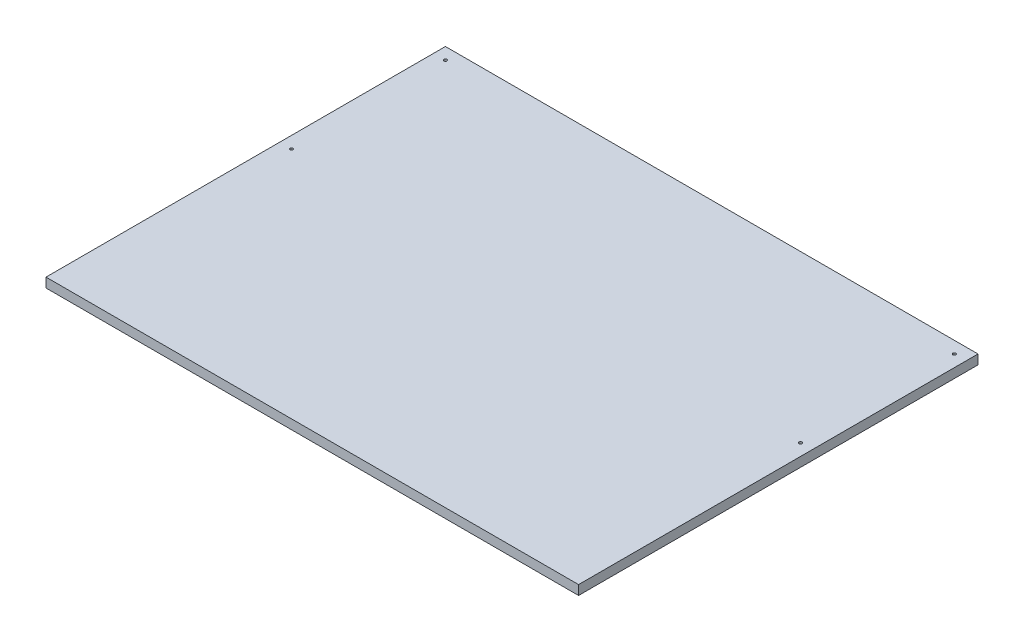
ISO-10303-21;
HEADER;
FILE_DESCRIPTION(('STEP AP214'),'2;1');
FILE_NAME('part.step','',(''),(''),'','','');
FILE_SCHEMA(('AUTOMOTIVE_DESIGN { 1 0 10303 214 1 1 1 1 }'));
ENDSEC;
DATA;
#1=APPLICATION_CONTEXT('core data for automotive mechanical design processes');
#2=APPLICATION_PROTOCOL_DEFINITION('international standard','automotive_design',2000,#1);
#3=PRODUCT_CONTEXT('',#1,'mechanical');
#4=PRODUCT('Part','Part','',(#3));
#5=PRODUCT_RELATED_PRODUCT_CATEGORY('part','',(#4));
#6=PRODUCT_DEFINITION_FORMATION('','',#4);
#7=PRODUCT_DEFINITION_CONTEXT('part definition',#1,'design');
#8=PRODUCT_DEFINITION('design','',#6,#7);
#9=PRODUCT_DEFINITION_SHAPE('','',#8);
#10=(LENGTH_UNIT() NAMED_UNIT(*) SI_UNIT(.MILLI.,.METRE.));
#11=(NAMED_UNIT(*) PLANE_ANGLE_UNIT() SI_UNIT($,.RADIAN.));
#12=(NAMED_UNIT(*) SI_UNIT($,.STERADIAN.) SOLID_ANGLE_UNIT());
#13=UNCERTAINTY_MEASURE_WITH_UNIT(LENGTH_MEASURE(1.E-05),#10,'distance_accuracy_value','');
#14=(GEOMETRIC_REPRESENTATION_CONTEXT(3) GLOBAL_UNCERTAINTY_ASSIGNED_CONTEXT((#13)) GLOBAL_UNIT_ASSIGNED_CONTEXT((#10,
#11,#12)) REPRESENTATION_CONTEXT('',''));
#15=CARTESIAN_POINT('',(0.,0.,0.));
#16=DIRECTION('',(0.,0.,1.));
#17=DIRECTION('',(1.,0.,0.));
#18=AXIS2_PLACEMENT_3D('',#15,#16,#17);
#19=CARTESIAN_POINT('',(0.,16.,0.));
#20=DIRECTION('',(0.,-1.,0.));
#21=DIRECTION('',(0.,0.,-1.));
#22=AXIS2_PLACEMENT_3D('',#19,#20,#21);
#23=PLANE('',#22);
#24=DIRECTION('',(0.,0.,-1.));
#25=VECTOR('',#24,1.);
#26=CARTESIAN_POINT('',(450.,16.,337.5));
#27=LINE('',#26,#25);
#28=CARTESIAN_POINT('',(450.,16.,337.5));
#29=VERTEX_POINT('',#28);
#30=CARTESIAN_POINT('',(450.,16.,-337.5));
#31=VERTEX_POINT('',#30);
#32=EDGE_CURVE('E91',#29,#31,#27,.T.);
#33=ORIENTED_EDGE('',*,*,#32,.T.);
#34=DIRECTION('',(-1.,0.,0.));
#35=VECTOR('',#34,1.);
#36=CARTESIAN_POINT('',(-450.,16.,-337.5));
#37=LINE('',#36,#35);
#38=CARTESIAN_POINT('',(-450.,16.,-337.5));
#39=VERTEX_POINT('',#38);
#40=EDGE_CURVE('E86',#31,#39,#37,.T.);
#41=ORIENTED_EDGE('',*,*,#40,.T.);
#42=DIRECTION('',(0.,0.,1.));
#43=VECTOR('',#42,1.);
#44=CARTESIAN_POINT('',(-450.,16.,337.5));
#45=LINE('',#44,#43);
#46=CARTESIAN_POINT('',(-450.,16.,337.5));
#47=VERTEX_POINT('',#46);
#48=EDGE_CURVE('E89',#39,#47,#45,.T.);
#49=ORIENTED_EDGE('',*,*,#48,.T.);
#50=DIRECTION('',(1.,0.,0.));
#51=VECTOR('',#50,1.);
#52=CARTESIAN_POINT('',(-450.,16.,337.5));
#53=LINE('',#52,#51);
#54=EDGE_CURVE('E56',#47,#29,#53,.T.);
#55=ORIENTED_EDGE('',*,*,#54,.T.);
#56=EDGE_LOOP('',(#33,#41,#49,#55));
#57=FACE_BOUND('',#56,.T.);
#58=CARTESIAN_POINT('',(-430.,16.,-317.5));
#59=DIRECTION('',(0.,1.,0.));
#60=DIRECTION('',(0.,0.,1.));
#61=AXIS2_PLACEMENT_3D('',#58,#59,#60);
#62=CIRCLE('',#61,2.50000000000002);
#63=CARTESIAN_POINT('',(-430.,16.,-315.));
#64=VERTEX_POINT('',#63);
#65=EDGE_CURVE('E106',#64,#64,#62,.T.);
#66=ORIENTED_EDGE('',*,*,#65,.F.);
#67=EDGE_LOOP('',(#66));
#68=FACE_BOUND('',#67,.T.);
#69=CARTESIAN_POINT('',(430.,16.,-317.5));
#70=DIRECTION('',(0.,1.,0.));
#71=DIRECTION('',(0.,0.,1.));
#72=AXIS2_PLACEMENT_3D('',#69,#70,#71);
#73=CIRCLE('',#72,2.50000000000002);
#74=CARTESIAN_POINT('',(430.,16.,-315.));
#75=VERTEX_POINT('',#74);
#76=EDGE_CURVE('E121',#75,#75,#73,.T.);
#77=ORIENTED_EDGE('',*,*,#76,.F.);
#78=EDGE_LOOP('',(#77));
#79=FACE_BOUND('',#78,.T.);
#80=CARTESIAN_POINT('',(430.,16.,-57.5));
#81=DIRECTION('',(0.,1.,0.));
#82=DIRECTION('',(0.,0.,1.));
#83=AXIS2_PLACEMENT_3D('',#80,#81,#82);
#84=CIRCLE('',#83,2.50000000000002);
#85=CARTESIAN_POINT('',(430.,16.,-55.));
#86=VERTEX_POINT('',#85);
#87=EDGE_CURVE('E127',#86,#86,#84,.T.);
#88=ORIENTED_EDGE('',*,*,#87,.F.);
#89=EDGE_LOOP('',(#88));
#90=FACE_BOUND('',#89,.T.);
#91=CARTESIAN_POINT('',(-430.,16.,-57.5));
#92=DIRECTION('',(0.,1.,0.));
#93=DIRECTION('',(0.,0.,1.));
#94=AXIS2_PLACEMENT_3D('',#91,#92,#93);
#95=CIRCLE('',#94,2.50000000000002);
#96=CARTESIAN_POINT('',(-430.,16.,-55.));
#97=VERTEX_POINT('',#96);
#98=EDGE_CURVE('E133',#97,#97,#95,.T.);
#99=ORIENTED_EDGE('',*,*,#98,.F.);
#100=EDGE_LOOP('',(#99));
#101=FACE_BOUND('',#100,.T.);
#102=ADVANCED_FACE('F39',(#57,#68,#79,#90,#101),#23,.F.);
#103=CARTESIAN_POINT('',(0.,0.,0.));
#104=DIRECTION('',(0.,-1.,0.));
#105=DIRECTION('',(0.,0.,-1.));
#106=AXIS2_PLACEMENT_3D('',#103,#104,#105);
#107=PLANE('',#106);
#108=CARTESIAN_POINT('',(430.,0.,-57.5));
#109=DIRECTION('',(0.,1.,0.));
#110=DIRECTION('',(0.,0.,1.));
#111=AXIS2_PLACEMENT_3D('',#108,#109,#110);
#112=CIRCLE('',#111,2.50000000000002);
#113=CARTESIAN_POINT('',(430.,0.,-55.));
#114=VERTEX_POINT('',#113);
#115=EDGE_CURVE('E130',#114,#114,#112,.T.);
#116=ORIENTED_EDGE('',*,*,#115,.T.);
#117=EDGE_LOOP('',(#116));
#118=FACE_BOUND('',#117,.T.);
#119=CARTESIAN_POINT('',(-430.,0.,-317.5));
#120=DIRECTION('',(0.,1.,0.));
#121=DIRECTION('',(0.,0.,1.));
#122=AXIS2_PLACEMENT_3D('',#119,#120,#121);
#123=CIRCLE('',#122,2.50000000000002);
#124=CARTESIAN_POINT('',(-430.,0.,-315.));
#125=VERTEX_POINT('',#124);
#126=EDGE_CURVE('E118',#125,#125,#123,.T.);
#127=ORIENTED_EDGE('',*,*,#126,.T.);
#128=EDGE_LOOP('',(#127));
#129=FACE_BOUND('',#128,.T.);
#130=DIRECTION('',(0.,0.,-1.));
#131=VECTOR('',#130,1.);
#132=CARTESIAN_POINT('',(450.,0.,337.5));
#133=LINE('',#132,#131);
#134=CARTESIAN_POINT('',(450.,0.,337.5));
#135=VERTEX_POINT('',#134);
#136=CARTESIAN_POINT('',(450.,0.,-337.5));
#137=VERTEX_POINT('',#136);
#138=EDGE_CURVE('E103',#135,#137,#133,.T.);
#139=ORIENTED_EDGE('',*,*,#138,.F.);
#140=DIRECTION('',(1.,0.,0.));
#141=VECTOR('',#140,1.);
#142=CARTESIAN_POINT('',(-450.,0.,337.5));
#143=LINE('',#142,#141);
#144=CARTESIAN_POINT('',(-450.,0.,337.5));
#145=VERTEX_POINT('',#144);
#146=EDGE_CURVE('E79',#145,#135,#143,.T.);
#147=ORIENTED_EDGE('',*,*,#146,.F.);
#148=DIRECTION('',(0.,0.,1.));
#149=VECTOR('',#148,1.);
#150=CARTESIAN_POINT('',(-450.,0.,337.5));
#151=LINE('',#150,#149);
#152=CARTESIAN_POINT('',(-450.,0.,-337.5));
#153=VERTEX_POINT('',#152);
#154=EDGE_CURVE('E73',#153,#145,#151,.T.);
#155=ORIENTED_EDGE('',*,*,#154,.F.);
#156=DIRECTION('',(-1.,0.,0.));
#157=VECTOR('',#156,1.);
#158=CARTESIAN_POINT('',(-450.,0.,-337.5));
#159=LINE('',#158,#157);
#160=EDGE_CURVE('E95',#137,#153,#159,.T.);
#161=ORIENTED_EDGE('',*,*,#160,.F.);
#162=EDGE_LOOP('',(#139,#147,#155,#161));
#163=FACE_BOUND('',#162,.T.);
#164=CARTESIAN_POINT('',(430.,0.,-317.5));
#165=DIRECTION('',(0.,1.,0.));
#166=DIRECTION('',(0.,0.,1.));
#167=AXIS2_PLACEMENT_3D('',#164,#165,#166);
#168=CIRCLE('',#167,2.50000000000002);
#169=CARTESIAN_POINT('',(430.,0.,-315.));
#170=VERTEX_POINT('',#169);
#171=EDGE_CURVE('E124',#170,#170,#168,.T.);
#172=ORIENTED_EDGE('',*,*,#171,.T.);
#173=EDGE_LOOP('',(#172));
#174=FACE_BOUND('',#173,.T.);
#175=CARTESIAN_POINT('',(-430.,0.,-57.5));
#176=DIRECTION('',(0.,1.,0.));
#177=DIRECTION('',(0.,0.,1.));
#178=AXIS2_PLACEMENT_3D('',#175,#176,#177);
#179=CIRCLE('',#178,2.50000000000002);
#180=CARTESIAN_POINT('',(-430.,0.,-55.));
#181=VERTEX_POINT('',#180);
#182=EDGE_CURVE('E136',#181,#181,#179,.T.);
#183=ORIENTED_EDGE('',*,*,#182,.T.);
#184=EDGE_LOOP('',(#183));
#185=FACE_BOUND('',#184,.T.);
#186=ADVANCED_FACE('F114',(#118,#129,#163,#174,#185),#107,.T.);
#187=CARTESIAN_POINT('',(450.,16.,337.5));
#188=DIRECTION('',(-1.,0.,0.));
#189=DIRECTION('',(0.,0.,1.));
#190=AXIS2_PLACEMENT_3D('',#187,#188,#189);
#191=PLANE('',#190);
#192=ORIENTED_EDGE('',*,*,#138,.T.);
#193=DIRECTION('',(0.,-1.,0.));
#194=VECTOR('',#193,1.);
#195=CARTESIAN_POINT('',(450.,16.,-337.5));
#196=LINE('',#195,#194);
#197=EDGE_CURVE('E11',#31,#137,#196,.T.);
#198=ORIENTED_EDGE('',*,*,#197,.F.);
#199=ORIENTED_EDGE('',*,*,#32,.F.);
#200=DIRECTION('',(0.,-1.,0.));
#201=VECTOR('',#200,1.);
#202=CARTESIAN_POINT('',(450.,16.,337.5));
#203=LINE('',#202,#201);
#204=EDGE_CURVE('E99',#29,#135,#203,.T.);
#205=ORIENTED_EDGE('',*,*,#204,.T.);
#206=EDGE_LOOP('',(#192,#198,#199,#205));
#207=FACE_BOUND('',#206,.T.);
#208=ADVANCED_FACE('F41',(#207),#191,.F.);
#209=CARTESIAN_POINT('',(-450.,16.,-337.5));
#210=DIRECTION('',(0.,0.,1.));
#211=DIRECTION('',(1.,0.,0.));
#212=AXIS2_PLACEMENT_3D('',#209,#210,#211);
#213=PLANE('',#212);
#214=ORIENTED_EDGE('',*,*,#160,.T.);
#215=DIRECTION('',(0.,-1.,0.));
#216=VECTOR('',#215,1.);
#217=CARTESIAN_POINT('',(-450.,16.,-337.5));
#218=LINE('',#217,#216);
#219=EDGE_CURVE('E48',#39,#153,#218,.T.);
#220=ORIENTED_EDGE('',*,*,#219,.F.);
#221=ORIENTED_EDGE('',*,*,#40,.F.);
#222=ORIENTED_EDGE('',*,*,#197,.T.);
#223=EDGE_LOOP('',(#214,#220,#221,#222));
#224=FACE_BOUND('',#223,.T.);
#225=ADVANCED_FACE('F94',(#224),#213,.F.);
#226=CARTESIAN_POINT('',(-450.,16.,337.5));
#227=DIRECTION('',(1.,0.,0.));
#228=DIRECTION('',(0.,0.,-1.));
#229=AXIS2_PLACEMENT_3D('',#226,#227,#228);
#230=PLANE('',#229);
#231=ORIENTED_EDGE('',*,*,#154,.T.);
#232=DIRECTION('',(0.,-1.,0.));
#233=VECTOR('',#232,1.);
#234=CARTESIAN_POINT('',(-450.,16.,337.5));
#235=LINE('',#234,#233);
#236=EDGE_CURVE('E96',#47,#145,#235,.T.);
#237=ORIENTED_EDGE('',*,*,#236,.F.);
#238=ORIENTED_EDGE('',*,*,#48,.F.);
#239=ORIENTED_EDGE('',*,*,#219,.T.);
#240=EDGE_LOOP('',(#231,#237,#238,#239));
#241=FACE_BOUND('',#240,.T.);
#242=ADVANCED_FACE('F97',(#241),#230,.F.);
#243=CARTESIAN_POINT('',(-450.,16.,337.5));
#244=DIRECTION('',(0.,0.,-1.));
#245=DIRECTION('',(-1.,0.,0.));
#246=AXIS2_PLACEMENT_3D('',#243,#244,#245);
#247=PLANE('',#246);
#248=ORIENTED_EDGE('',*,*,#146,.T.);
#249=ORIENTED_EDGE('',*,*,#204,.F.);
#250=ORIENTED_EDGE('',*,*,#54,.F.);
#251=ORIENTED_EDGE('',*,*,#236,.T.);
#252=EDGE_LOOP('',(#248,#249,#250,#251));
#253=FACE_BOUND('',#252,.T.);
#254=ADVANCED_FACE('F111',(#253),#247,.F.);
#255=CARTESIAN_POINT('',(-430.,16.,-317.5));
#256=DIRECTION('',(0.,-1.,0.));
#257=DIRECTION('',(0.,0.,-1.));
#258=AXIS2_PLACEMENT_3D('',#255,#256,#257);
#259=CYLINDRICAL_SURFACE('',#258,2.50000000000002);
#260=ORIENTED_EDGE('',*,*,#65,.T.);
#261=EDGE_LOOP('',(#260));
#262=FACE_BOUND('',#261,.T.);
#263=ORIENTED_EDGE('',*,*,#126,.F.);
#264=EDGE_LOOP('',(#263));
#265=FACE_BOUND('',#264,.T.);
#266=ADVANCED_FACE('F153',(#262,#265),#259,.F.);
#267=CARTESIAN_POINT('',(430.,16.,-317.5));
#268=DIRECTION('',(0.,-1.,0.));
#269=DIRECTION('',(0.,0.,-1.));
#270=AXIS2_PLACEMENT_3D('',#267,#268,#269);
#271=CYLINDRICAL_SURFACE('',#270,2.50000000000002);
#272=ORIENTED_EDGE('',*,*,#76,.T.);
#273=EDGE_LOOP('',(#272));
#274=FACE_BOUND('',#273,.T.);
#275=ORIENTED_EDGE('',*,*,#171,.F.);
#276=EDGE_LOOP('',(#275));
#277=FACE_BOUND('',#276,.T.);
#278=ADVANCED_FACE('F207',(#274,#277),#271,.F.);
#279=CARTESIAN_POINT('',(430.,16.,-57.5));
#280=DIRECTION('',(0.,-1.,0.));
#281=DIRECTION('',(0.,0.,-1.));
#282=AXIS2_PLACEMENT_3D('',#279,#280,#281);
#283=CYLINDRICAL_SURFACE('',#282,2.50000000000002);
#284=ORIENTED_EDGE('',*,*,#87,.T.);
#285=EDGE_LOOP('',(#284));
#286=FACE_BOUND('',#285,.T.);
#287=ORIENTED_EDGE('',*,*,#115,.F.);
#288=EDGE_LOOP('',(#287));
#289=FACE_BOUND('',#288,.T.);
#290=ADVANCED_FACE('F216',(#286,#289),#283,.F.);
#291=CARTESIAN_POINT('',(-430.,16.,-57.5));
#292=DIRECTION('',(0.,-1.,0.));
#293=DIRECTION('',(0.,0.,-1.));
#294=AXIS2_PLACEMENT_3D('',#291,#292,#293);
#295=CYLINDRICAL_SURFACE('',#294,2.50000000000002);
#296=ORIENTED_EDGE('',*,*,#98,.T.);
#297=EDGE_LOOP('',(#296));
#298=FACE_BOUND('',#297,.T.);
#299=ORIENTED_EDGE('',*,*,#182,.F.);
#300=EDGE_LOOP('',(#299));
#301=FACE_BOUND('',#300,.T.);
#302=ADVANCED_FACE('F142',(#298,#301),#295,.F.);
#303=CLOSED_SHELL('',(#102,#186,#208,#225,#242,#254,#266,#278,#290,#302));
#304=MANIFOLD_SOLID_BREP('B2',#303);
#305=ADVANCED_BREP_SHAPE_REPRESENTATION('',(#18,#304),#14);
#306=SHAPE_DEFINITION_REPRESENTATION(#9,#305);
ENDSEC;
END-ISO-10303-21;
